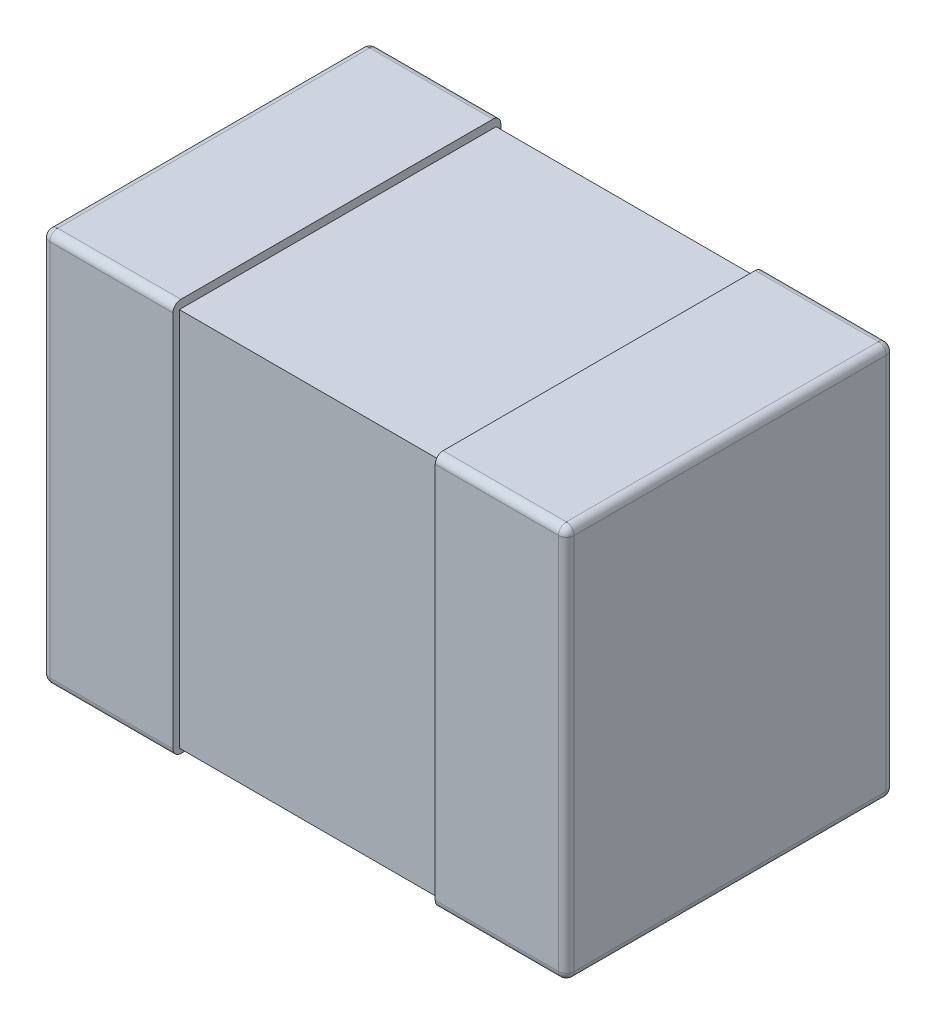
ISO-10303-21;
HEADER;
FILE_DESCRIPTION(('STEP AP214'),'2;1');
FILE_NAME('part.step','',(''),(''),'','','');
FILE_SCHEMA(('AUTOMOTIVE_DESIGN { 1 0 10303 214 1 1 1 1 }'));
ENDSEC;
DATA;
#1=APPLICATION_CONTEXT('core data for automotive mechanical design processes');
#2=APPLICATION_PROTOCOL_DEFINITION('international standard','automotive_design',2000,#1);
#3=PRODUCT_CONTEXT('',#1,'mechanical');
#4=PRODUCT('Part','Part','',(#3));
#5=PRODUCT_RELATED_PRODUCT_CATEGORY('part','',(#4));
#6=PRODUCT_DEFINITION_FORMATION('','',#4);
#7=PRODUCT_DEFINITION_CONTEXT('part definition',#1,'design');
#8=PRODUCT_DEFINITION('design','',#6,#7);
#9=PRODUCT_DEFINITION_SHAPE('','',#8);
#10=(LENGTH_UNIT() NAMED_UNIT(*) SI_UNIT(.MILLI.,.METRE.));
#11=(NAMED_UNIT(*) PLANE_ANGLE_UNIT() SI_UNIT($,.RADIAN.));
#12=(NAMED_UNIT(*) SI_UNIT($,.STERADIAN.) SOLID_ANGLE_UNIT());
#13=UNCERTAINTY_MEASURE_WITH_UNIT(LENGTH_MEASURE(1.E-05),#10,'distance_accuracy_value','');
#14=(GEOMETRIC_REPRESENTATION_CONTEXT(3) GLOBAL_UNCERTAINTY_ASSIGNED_CONTEXT((#13)) GLOBAL_UNIT_ASSIGNED_CONTEXT((#10,
#11,#12)) REPRESENTATION_CONTEXT('',''));
#15=CARTESIAN_POINT('',(0.,0.,0.));
#16=DIRECTION('',(0.,0.,1.));
#17=DIRECTION('',(1.,0.,0.));
#18=AXIS2_PLACEMENT_3D('',#15,#16,#17);
#19=CARTESIAN_POINT('',(0.5,1.5,0.));
#20=DIRECTION('',(1.,0.,0.));
#21=DIRECTION('',(0.,0.,-1.));
#22=AXIS2_PLACEMENT_3D('',#19,#20,#21);
#23=PLANE('',#22);
#24=DIRECTION('',(0.,1.,0.));
#25=VECTOR('',#24,1.);
#26=CARTESIAN_POINT('',(0.5,0.,0.));
#27=LINE('',#26,#25);
#28=CARTESIAN_POINT('',(0.5,0.03,0.));
#29=VERTEX_POINT('',#28);
#30=CARTESIAN_POINT('',(0.5,1.47,0.));
#31=VERTEX_POINT('',#30);
#32=EDGE_CURVE('E11',#29,#31,#27,.T.);
#33=ORIENTED_EDGE('',*,*,#32,.T.);
#34=CARTESIAN_POINT('',(0.5,1.47,0.03));
#35=DIRECTION('',(1.,0.,0.));
#36=DIRECTION('',(0.,0.,-1.));
#37=AXIS2_PLACEMENT_3D('',#34,#35,#36);
#38=CIRCLE('',#37,0.03);
#39=CARTESIAN_POINT('',(0.5,1.5,0.03));
#40=VERTEX_POINT('',#39);
#41=EDGE_CURVE('E24',#31,#40,#38,.T.);
#42=ORIENTED_EDGE('',*,*,#41,.T.);
#43=DIRECTION('',(0.,0.,1.));
#44=VECTOR('',#43,1.);
#45=CARTESIAN_POINT('',(0.5,1.5,0.));
#46=LINE('',#45,#44);
#47=CARTESIAN_POINT('',(0.5,1.5,1.22));
#48=VERTEX_POINT('',#47);
#49=EDGE_CURVE('E381',#40,#48,#46,.T.);
#50=ORIENTED_EDGE('',*,*,#49,.T.);
#51=CARTESIAN_POINT('',(0.5,1.47,1.22));
#52=DIRECTION('',(1.,0.,0.));
#53=DIRECTION('',(0.,0.,-1.));
#54=AXIS2_PLACEMENT_3D('',#51,#52,#53);
#55=CIRCLE('',#54,0.0300000000000001);
#56=CARTESIAN_POINT('',(0.5,1.47,1.25));
#57=VERTEX_POINT('',#56);
#58=EDGE_CURVE('E379',#48,#57,#55,.T.);
#59=ORIENTED_EDGE('',*,*,#58,.T.);
#60=DIRECTION('',(0.,-1.,0.));
#61=VECTOR('',#60,1.);
#62=CARTESIAN_POINT('',(0.5,0.,1.25));
#63=LINE('',#62,#61);
#64=CARTESIAN_POINT('',(0.5,0.0299999999999998,1.25));
#65=VERTEX_POINT('',#64);
#66=EDGE_CURVE('E377',#57,#65,#63,.T.);
#67=ORIENTED_EDGE('',*,*,#66,.T.);
#68=CARTESIAN_POINT('',(0.5,0.0299999999999998,1.22));
#69=DIRECTION('',(1.,0.,0.));
#70=DIRECTION('',(0.,0.,-1.));
#71=AXIS2_PLACEMENT_3D('',#68,#69,#70);
#72=CIRCLE('',#71,0.0300000000000001);
#73=CARTESIAN_POINT('',(0.5,0.,1.22));
#74=VERTEX_POINT('',#73);
#75=EDGE_CURVE('E375',#65,#74,#72,.T.);
#76=ORIENTED_EDGE('',*,*,#75,.T.);
#77=DIRECTION('',(0.,0.,-1.));
#78=VECTOR('',#77,1.);
#79=CARTESIAN_POINT('',(0.5,0.,0.));
#80=LINE('',#79,#78);
#81=CARTESIAN_POINT('',(0.5,0.,0.03));
#82=VERTEX_POINT('',#81);
#83=EDGE_CURVE('E373',#74,#82,#80,.T.);
#84=ORIENTED_EDGE('',*,*,#83,.T.);
#85=CARTESIAN_POINT('',(0.5,0.03,0.03));
#86=DIRECTION('',(1.,0.,0.));
#87=DIRECTION('',(0.,0.,-1.));
#88=AXIS2_PLACEMENT_3D('',#85,#86,#87);
#89=CIRCLE('',#88,0.03);
#90=EDGE_CURVE('E371',#82,#29,#89,.T.);
#91=ORIENTED_EDGE('',*,*,#90,.T.);
#92=EDGE_LOOP('',(#33,#42,#50,#59,#67,#76,#84,#91));
#93=FACE_BOUND('',#92,.T.);
#94=DIRECTION('',(0.,0.,-1.));
#95=VECTOR('',#94,1.);
#96=CARTESIAN_POINT('',(0.5,0.0205616848063398,1.22589832555352));
#97=LINE('',#96,#95);
#98=CARTESIAN_POINT('',(0.5,0.0205616848063398,1.22589832555352));
#99=VERTEX_POINT('',#98);
#100=CARTESIAN_POINT('',(0.5,0.0205616848063398,0.0178314310494022));
#101=VERTEX_POINT('',#100);
#102=EDGE_CURVE('E369',#99,#101,#97,.T.);
#103=ORIENTED_EDGE('',*,*,#102,.F.);
#104=DIRECTION('',(0.,-1.,0.));
#105=VECTOR('',#104,1.);
#106=CARTESIAN_POINT('',(0.5,1.46898790953186,1.22589832555352));
#107=LINE('',#106,#105);
#108=CARTESIAN_POINT('',(0.5,1.46898790953186,1.22589832555352));
#109=VERTEX_POINT('',#108);
#110=EDGE_CURVE('E366',#109,#99,#107,.T.);
#111=ORIENTED_EDGE('',*,*,#110,.F.);
#112=DIRECTION('',(0.,0.,1.));
#113=VECTOR('',#112,1.);
#114=CARTESIAN_POINT('',(0.5,1.46898790953186,1.22589832555352));
#115=LINE('',#114,#113);
#116=CARTESIAN_POINT('',(0.5,1.46898790953186,0.0178314310494022));
#117=VERTEX_POINT('',#116);
#118=EDGE_CURVE('E363',#117,#109,#115,.T.);
#119=ORIENTED_EDGE('',*,*,#118,.F.);
#120=DIRECTION('',(0.,1.,0.));
#121=VECTOR('',#120,1.);
#122=CARTESIAN_POINT('',(0.5,1.46898790953186,0.0178314310494022));
#123=LINE('',#122,#121);
#124=EDGE_CURVE('E360',#101,#117,#123,.T.);
#125=ORIENTED_EDGE('',*,*,#124,.F.);
#126=EDGE_LOOP('',(#103,#111,#119,#125));
#127=FACE_BOUND('',#126,.T.);
#128=ADVANCED_FACE('F17',(#93,#127),#23,.T.);
#129=CARTESIAN_POINT('',(0.5,0.,0.));
#130=DIRECTION('',(0.,0.,1.));
#131=DIRECTION('',(1.,0.,0.));
#132=AXIS2_PLACEMENT_3D('',#129,#130,#131);
#133=PLANE('',#132);
#134=DIRECTION('',(0.,1.,0.));
#135=VECTOR('',#134,1.);
#136=CARTESIAN_POINT('',(0.03,0.,0.));
#137=LINE('',#136,#135);
#138=CARTESIAN_POINT('',(0.03,0.03,0.));
#139=VERTEX_POINT('',#138);
#140=CARTESIAN_POINT('',(0.03,1.47,0.));
#141=VERTEX_POINT('',#140);
#142=EDGE_CURVE('E358',#139,#141,#137,.T.);
#143=ORIENTED_EDGE('',*,*,#142,.T.);
#144=DIRECTION('',(1.,0.,0.));
#145=VECTOR('',#144,1.);
#146=CARTESIAN_POINT('',(0.5,1.47,0.));
#147=LINE('',#146,#145);
#148=EDGE_CURVE('E356',#141,#31,#147,.T.);
#149=ORIENTED_EDGE('',*,*,#148,.T.);
#150=ORIENTED_EDGE('',*,*,#32,.F.);
#151=DIRECTION('',(-1.,0.,0.));
#152=VECTOR('',#151,1.);
#153=CARTESIAN_POINT('',(0.5,0.03,0.));
#154=LINE('',#153,#152);
#155=EDGE_CURVE('E354',#29,#139,#154,.T.);
#156=ORIENTED_EDGE('',*,*,#155,.T.);
#157=EDGE_LOOP('',(#143,#149,#150,#156));
#158=FACE_BOUND('',#157,.T.);
#159=ADVANCED_FACE('F487',(#158),#133,.F.);
#160=CARTESIAN_POINT('',(0.5,1.5,0.));
#161=DIRECTION('',(0.,-1.,0.));
#162=DIRECTION('',(0.,0.,-1.));
#163=AXIS2_PLACEMENT_3D('',#160,#161,#162);
#164=PLANE('',#163);
#165=ORIENTED_EDGE('',*,*,#49,.F.);
#166=DIRECTION('',(-1.,0.,0.));
#167=VECTOR('',#166,1.);
#168=CARTESIAN_POINT('',(0.5,1.5,0.03));
#169=LINE('',#168,#167);
#170=CARTESIAN_POINT('',(0.03,1.5,0.03));
#171=VERTEX_POINT('',#170);
#172=EDGE_CURVE('E352',#40,#171,#169,.T.);
#173=ORIENTED_EDGE('',*,*,#172,.T.);
#174=DIRECTION('',(0.,0.,1.));
#175=VECTOR('',#174,1.);
#176=CARTESIAN_POINT('',(0.03,1.5,0.));
#177=LINE('',#176,#175);
#178=CARTESIAN_POINT('',(0.03,1.5,1.22));
#179=VERTEX_POINT('',#178);
#180=EDGE_CURVE('E350',#171,#179,#177,.T.);
#181=ORIENTED_EDGE('',*,*,#180,.T.);
#182=DIRECTION('',(1.,0.,0.));
#183=VECTOR('',#182,1.);
#184=CARTESIAN_POINT('',(0.5,1.5,1.22));
#185=LINE('',#184,#183);
#186=EDGE_CURVE('E347',#179,#48,#185,.T.);
#187=ORIENTED_EDGE('',*,*,#186,.T.);
#188=EDGE_LOOP('',(#165,#173,#181,#187));
#189=FACE_BOUND('',#188,.T.);
#190=ADVANCED_FACE('F389',(#189),#164,.F.);
#191=CARTESIAN_POINT('',(0.5,0.,1.25));
#192=DIRECTION('',(0.,0.,-1.));
#193=DIRECTION('',(-1.,0.,0.));
#194=AXIS2_PLACEMENT_3D('',#191,#192,#193);
#195=PLANE('',#194);
#196=DIRECTION('',(0.,-1.,0.));
#197=VECTOR('',#196,1.);
#198=CARTESIAN_POINT('',(0.03,0.,1.25));
#199=LINE('',#198,#197);
#200=CARTESIAN_POINT('',(0.03,1.47,1.25));
#201=VERTEX_POINT('',#200);
#202=CARTESIAN_POINT('',(0.03,0.0299999999999998,1.25));
#203=VERTEX_POINT('',#202);
#204=EDGE_CURVE('E345',#201,#203,#199,.T.);
#205=ORIENTED_EDGE('',*,*,#204,.T.);
#206=DIRECTION('',(1.,0.,0.));
#207=VECTOR('',#206,1.);
#208=CARTESIAN_POINT('',(0.5,0.0299999999999998,1.25));
#209=LINE('',#208,#207);
#210=EDGE_CURVE('E342',#203,#65,#209,.T.);
#211=ORIENTED_EDGE('',*,*,#210,.T.);
#212=ORIENTED_EDGE('',*,*,#66,.F.);
#213=DIRECTION('',(-1.,0.,0.));
#214=VECTOR('',#213,1.);
#215=CARTESIAN_POINT('',(0.5,1.47,1.25));
#216=LINE('',#215,#214);
#217=EDGE_CURVE('E339',#57,#201,#216,.T.);
#218=ORIENTED_EDGE('',*,*,#217,.T.);
#219=EDGE_LOOP('',(#205,#211,#212,#218));
#220=FACE_BOUND('',#219,.T.);
#221=ADVANCED_FACE('F465',(#220),#195,.F.);
#222=CARTESIAN_POINT('',(0.5,0.,0.));
#223=DIRECTION('',(0.,1.,0.));
#224=DIRECTION('',(0.,0.,1.));
#225=AXIS2_PLACEMENT_3D('',#222,#223,#224);
#226=PLANE('',#225);
#227=DIRECTION('',(0.,0.,-1.));
#228=VECTOR('',#227,1.);
#229=CARTESIAN_POINT('',(0.03,0.,0.));
#230=LINE('',#229,#228);
#231=CARTESIAN_POINT('',(0.03,0.,1.22));
#232=VERTEX_POINT('',#231);
#233=CARTESIAN_POINT('',(0.03,0.,0.03));
#234=VERTEX_POINT('',#233);
#235=EDGE_CURVE('E337',#232,#234,#230,.T.);
#236=ORIENTED_EDGE('',*,*,#235,.T.);
#237=DIRECTION('',(1.,0.,0.));
#238=VECTOR('',#237,1.);
#239=CARTESIAN_POINT('',(0.5,0.,0.03));
#240=LINE('',#239,#238);
#241=EDGE_CURVE('E334',#234,#82,#240,.T.);
#242=ORIENTED_EDGE('',*,*,#241,.T.);
#243=ORIENTED_EDGE('',*,*,#83,.F.);
#244=DIRECTION('',(-1.,0.,0.));
#245=VECTOR('',#244,1.);
#246=CARTESIAN_POINT('',(0.5,0.,1.22));
#247=LINE('',#246,#245);
#248=EDGE_CURVE('E331',#74,#232,#247,.T.);
#249=ORIENTED_EDGE('',*,*,#248,.T.);
#250=EDGE_LOOP('',(#236,#242,#243,#249));
#251=FACE_BOUND('',#250,.T.);
#252=ADVANCED_FACE('F498',(#251),#226,.F.);
#253=CARTESIAN_POINT('',(0.,1.5,0.));
#254=DIRECTION('',(1.,0.,0.));
#255=DIRECTION('',(0.,0.,-1.));
#256=AXIS2_PLACEMENT_3D('',#253,#254,#255);
#257=PLANE('',#256);
#258=DIRECTION('',(0.,1.,0.));
#259=VECTOR('',#258,1.);
#260=CARTESIAN_POINT('',(0.,1.5,1.22));
#261=LINE('',#260,#259);
#262=CARTESIAN_POINT('',(0.,0.0299999999999998,1.22));
#263=VERTEX_POINT('',#262);
#264=CARTESIAN_POINT('',(0.,1.47,1.22));
#265=VERTEX_POINT('',#264);
#266=EDGE_CURVE('E329',#263,#265,#261,.T.);
#267=ORIENTED_EDGE('',*,*,#266,.T.);
#268=DIRECTION('',(0.,0.,-1.));
#269=VECTOR('',#268,1.);
#270=CARTESIAN_POINT('',(0.,1.47,0.));
#271=LINE('',#270,#269);
#272=CARTESIAN_POINT('',(0.,1.47,0.03));
#273=VERTEX_POINT('',#272);
#274=EDGE_CURVE('E327',#265,#273,#271,.T.);
#275=ORIENTED_EDGE('',*,*,#274,.T.);
#276=DIRECTION('',(0.,-1.,0.));
#277=VECTOR('',#276,1.);
#278=CARTESIAN_POINT('',(0.,1.5,0.03));
#279=LINE('',#278,#277);
#280=CARTESIAN_POINT('',(0.,0.03,0.03));
#281=VERTEX_POINT('',#280);
#282=EDGE_CURVE('E325',#273,#281,#279,.T.);
#283=ORIENTED_EDGE('',*,*,#282,.T.);
#284=DIRECTION('',(0.,0.,1.));
#285=VECTOR('',#284,1.);
#286=CARTESIAN_POINT('',(0.,0.0300000000000001,0.));
#287=LINE('',#286,#285);
#288=EDGE_CURVE('E322',#281,#263,#287,.T.);
#289=ORIENTED_EDGE('',*,*,#288,.T.);
#290=EDGE_LOOP('',(#267,#275,#283,#289));
#291=FACE_BOUND('',#290,.T.);
#292=ADVANCED_FACE('F449',(#291),#257,.F.);
#293=CARTESIAN_POINT('',(1.5,1.46898790953186,1.22589832555352));
#294=DIRECTION('',(0.,0.,-1.));
#295=DIRECTION('',(-1.,0.,0.));
#296=AXIS2_PLACEMENT_3D('',#293,#294,#295);
#297=PLANE('',#296);
#298=ORIENTED_EDGE('',*,*,#110,.T.);
#299=DIRECTION('',(-1.,0.,0.));
#300=VECTOR('',#299,1.);
#301=CARTESIAN_POINT('',(1.5,0.0205616848063398,1.22589832555352));
#302=LINE('',#301,#300);
#303=CARTESIAN_POINT('',(1.5,0.0205616848063398,1.22589832555352));
#304=VERTEX_POINT('',#303);
#305=EDGE_CURVE('E319',#304,#99,#302,.T.);
#306=ORIENTED_EDGE('',*,*,#305,.F.);
#307=DIRECTION('',(0.,-1.,0.));
#308=VECTOR('',#307,1.);
#309=CARTESIAN_POINT('',(1.5,1.46898790953186,1.22589832555352));
#310=LINE('',#309,#308);
#311=CARTESIAN_POINT('',(1.5,1.46898790953186,1.22589832555352));
#312=VERTEX_POINT('',#311);
#313=EDGE_CURVE('E316',#312,#304,#310,.T.);
#314=ORIENTED_EDGE('',*,*,#313,.F.);
#315=DIRECTION('',(-1.,0.,0.));
#316=VECTOR('',#315,1.);
#317=CARTESIAN_POINT('',(1.5,1.46898790953186,1.22589832555352));
#318=LINE('',#317,#316);
#319=EDGE_CURVE('E313',#312,#109,#318,.T.);
#320=ORIENTED_EDGE('',*,*,#319,.T.);
#321=EDGE_LOOP('',(#298,#306,#314,#320));
#322=FACE_BOUND('',#321,.T.);
#323=ADVANCED_FACE('F503',(#322),#297,.F.);
#324=CARTESIAN_POINT('',(1.5,0.0205616848063398,1.22589832555352));
#325=DIRECTION('',(0.,1.,0.));
#326=DIRECTION('',(0.,0.,1.));
#327=AXIS2_PLACEMENT_3D('',#324,#325,#326);
#328=PLANE('',#327);
#329=ORIENTED_EDGE('',*,*,#102,.T.);
#330=DIRECTION('',(-1.,0.,0.));
#331=VECTOR('',#330,1.);
#332=CARTESIAN_POINT('',(1.5,0.0205616848063398,0.0178314310494022));
#333=LINE('',#332,#331);
#334=CARTESIAN_POINT('',(1.5,0.0205616848063398,0.0178314310494022));
#335=VERTEX_POINT('',#334);
#336=EDGE_CURVE('E310',#335,#101,#333,.T.);
#337=ORIENTED_EDGE('',*,*,#336,.F.);
#338=DIRECTION('',(0.,0.,-1.));
#339=VECTOR('',#338,1.);
#340=CARTESIAN_POINT('',(1.5,0.0205616848063398,1.22589832555352));
#341=LINE('',#340,#339);
#342=EDGE_CURVE('E307',#304,#335,#341,.T.);
#343=ORIENTED_EDGE('',*,*,#342,.F.);
#344=ORIENTED_EDGE('',*,*,#305,.T.);
#345=EDGE_LOOP('',(#329,#337,#343,#344));
#346=FACE_BOUND('',#345,.T.);
#347=ADVANCED_FACE('F506',(#346),#328,.F.);
#348=CARTESIAN_POINT('',(1.5,1.46898790953186,0.0178314310494022));
#349=DIRECTION('',(0.,0.,1.));
#350=DIRECTION('',(1.,0.,0.));
#351=AXIS2_PLACEMENT_3D('',#348,#349,#350);
#352=PLANE('',#351);
#353=ORIENTED_EDGE('',*,*,#124,.T.);
#354=DIRECTION('',(-1.,0.,0.));
#355=VECTOR('',#354,1.);
#356=CARTESIAN_POINT('',(1.5,1.46898790953186,0.0178314310494022));
#357=LINE('',#356,#355);
#358=CARTESIAN_POINT('',(1.5,1.46898790953186,0.0178314310494022));
#359=VERTEX_POINT('',#358);
#360=EDGE_CURVE('E304',#359,#117,#357,.T.);
#361=ORIENTED_EDGE('',*,*,#360,.F.);
#362=DIRECTION('',(0.,1.,0.));
#363=VECTOR('',#362,1.);
#364=CARTESIAN_POINT('',(1.5,1.46898790953186,0.0178314310494022));
#365=LINE('',#364,#363);
#366=EDGE_CURVE('E301',#335,#359,#365,.T.);
#367=ORIENTED_EDGE('',*,*,#366,.F.);
#368=ORIENTED_EDGE('',*,*,#336,.T.);
#369=EDGE_LOOP('',(#353,#361,#367,#368));
#370=FACE_BOUND('',#369,.T.);
#371=ADVANCED_FACE('F510',(#370),#352,.F.);
#372=CARTESIAN_POINT('',(1.5,1.46898790953186,1.22589832555352));
#373=DIRECTION('',(0.,-1.,0.));
#374=DIRECTION('',(0.,0.,-1.));
#375=AXIS2_PLACEMENT_3D('',#372,#373,#374);
#376=PLANE('',#375);
#377=ORIENTED_EDGE('',*,*,#118,.T.);
#378=ORIENTED_EDGE('',*,*,#319,.F.);
#379=DIRECTION('',(0.,0.,1.));
#380=VECTOR('',#379,1.);
#381=CARTESIAN_POINT('',(1.5,1.46898790953186,1.22589832555352));
#382=LINE('',#381,#380);
#383=EDGE_CURVE('E298',#359,#312,#382,.T.);
#384=ORIENTED_EDGE('',*,*,#383,.F.);
#385=ORIENTED_EDGE('',*,*,#360,.T.);
#386=EDGE_LOOP('',(#377,#378,#384,#385));
#387=FACE_BOUND('',#386,.T.);
#388=ADVANCED_FACE('F514',(#387),#376,.F.);
#389=CARTESIAN_POINT('',(1.5,0.,1.25));
#390=DIRECTION('',(1.,0.,0.));
#391=DIRECTION('',(0.,0.,-1.));
#392=AXIS2_PLACEMENT_3D('',#389,#390,#391);
#393=PLANE('',#392);
#394=DIRECTION('',(0.,0.,1.));
#395=VECTOR('',#394,1.);
#396=CARTESIAN_POINT('',(1.5,1.5,1.25));
#397=LINE('',#396,#395);
#398=CARTESIAN_POINT('',(1.5,1.5,0.0300000000000001));
#399=VERTEX_POINT('',#398);
#400=CARTESIAN_POINT('',(1.5,1.5,1.22));
#401=VERTEX_POINT('',#400);
#402=EDGE_CURVE('E296',#399,#401,#397,.T.);
#403=ORIENTED_EDGE('',*,*,#402,.F.);
#404=CARTESIAN_POINT('',(1.5,1.47,0.0300000000000001));
#405=DIRECTION('',(-1.,0.,0.));
#406=DIRECTION('',(0.,0.,-1.));
#407=AXIS2_PLACEMENT_3D('',#404,#405,#406);
#408=CIRCLE('',#407,0.03);
#409=CARTESIAN_POINT('',(1.5,1.47,0.));
#410=VERTEX_POINT('',#409);
#411=EDGE_CURVE('E294',#399,#410,#408,.T.);
#412=ORIENTED_EDGE('',*,*,#411,.T.);
#413=DIRECTION('',(0.,1.,0.));
#414=VECTOR('',#413,1.);
#415=CARTESIAN_POINT('',(1.5,1.5,0.));
#416=LINE('',#415,#414);
#417=CARTESIAN_POINT('',(1.5,0.0300000000000001,0.));
#418=VERTEX_POINT('',#417);
#419=EDGE_CURVE('E291',#418,#410,#416,.T.);
#420=ORIENTED_EDGE('',*,*,#419,.F.);
#421=CARTESIAN_POINT('',(1.5,0.0300000000000001,0.03));
#422=DIRECTION('',(-1.,0.,0.));
#423=DIRECTION('',(0.,0.,-1.));
#424=AXIS2_PLACEMENT_3D('',#421,#422,#423);
#425=CIRCLE('',#424,0.03);
#426=CARTESIAN_POINT('',(1.5,0.,0.0300000000000001));
#427=VERTEX_POINT('',#426);
#428=EDGE_CURVE('E289',#418,#427,#425,.T.);
#429=ORIENTED_EDGE('',*,*,#428,.T.);
#430=DIRECTION('',(0.,0.,-1.));
#431=VECTOR('',#430,1.);
#432=CARTESIAN_POINT('',(1.5,0.,1.25));
#433=LINE('',#432,#431);
#434=CARTESIAN_POINT('',(1.5,0.,1.22));
#435=VERTEX_POINT('',#434);
#436=EDGE_CURVE('E286',#435,#427,#433,.T.);
#437=ORIENTED_EDGE('',*,*,#436,.F.);
#438=CARTESIAN_POINT('',(1.5,0.03,1.22));
#439=DIRECTION('',(-1.,0.,0.));
#440=DIRECTION('',(0.,0.,-1.));
#441=AXIS2_PLACEMENT_3D('',#438,#439,#440);
#442=CIRCLE('',#441,0.0300000000000001);
#443=CARTESIAN_POINT('',(1.5,0.0300000000000001,1.25));
#444=VERTEX_POINT('',#443);
#445=EDGE_CURVE('E284',#435,#444,#442,.T.);
#446=ORIENTED_EDGE('',*,*,#445,.T.);
#447=DIRECTION('',(0.,-1.,0.));
#448=VECTOR('',#447,1.);
#449=CARTESIAN_POINT('',(1.5,1.5,1.25));
#450=LINE('',#449,#448);
#451=CARTESIAN_POINT('',(1.5,1.47,1.25));
#452=VERTEX_POINT('',#451);
#453=EDGE_CURVE('E281',#452,#444,#450,.T.);
#454=ORIENTED_EDGE('',*,*,#453,.F.);
#455=CARTESIAN_POINT('',(1.5,1.47,1.22));
#456=DIRECTION('',(-1.,0.,0.));
#457=DIRECTION('',(0.,0.,-1.));
#458=AXIS2_PLACEMENT_3D('',#455,#456,#457);
#459=CIRCLE('',#458,0.0300000000000001);
#460=EDGE_CURVE('E278',#452,#401,#459,.T.);
#461=ORIENTED_EDGE('',*,*,#460,.T.);
#462=EDGE_LOOP('',(#403,#412,#420,#429,#437,#446,#454,#461));
#463=FACE_BOUND('',#462,.T.);
#464=ORIENTED_EDGE('',*,*,#383,.T.);
#465=ORIENTED_EDGE('',*,*,#313,.T.);
#466=ORIENTED_EDGE('',*,*,#342,.T.);
#467=ORIENTED_EDGE('',*,*,#366,.T.);
#468=EDGE_LOOP('',(#464,#465,#466,#467));
#469=FACE_BOUND('',#468,.T.);
#470=ADVANCED_FACE('F518',(#463,#469),#393,.F.);
#471=CARTESIAN_POINT('',(2.,1.5,1.25));
#472=DIRECTION('',(0.,0.,-1.));
#473=DIRECTION('',(-1.,0.,0.));
#474=AXIS2_PLACEMENT_3D('',#471,#472,#473);
#475=PLANE('',#474);
#476=DIRECTION('',(0.,1.,0.));
#477=VECTOR('',#476,1.);
#478=CARTESIAN_POINT('',(1.97,1.5,1.25));
#479=LINE('',#478,#477);
#480=CARTESIAN_POINT('',(1.97,0.0300000000000001,1.25));
#481=VERTEX_POINT('',#480);
#482=CARTESIAN_POINT('',(1.97,1.47,1.25));
#483=VERTEX_POINT('',#482);
#484=EDGE_CURVE('E207',#481,#483,#479,.T.);
#485=ORIENTED_EDGE('',*,*,#484,.T.);
#486=DIRECTION('',(-1.,0.,0.));
#487=VECTOR('',#486,1.);
#488=CARTESIAN_POINT('',(2.,1.47,1.25));
#489=LINE('',#488,#487);
#490=EDGE_CURVE('E274',#483,#452,#489,.T.);
#491=ORIENTED_EDGE('',*,*,#490,.T.);
#492=ORIENTED_EDGE('',*,*,#453,.T.);
#493=DIRECTION('',(1.,0.,0.));
#494=VECTOR('',#493,1.);
#495=CARTESIAN_POINT('',(2.,0.0300000000000001,1.25));
#496=LINE('',#495,#494);
#497=EDGE_CURVE('E272',#444,#481,#496,.T.);
#498=ORIENTED_EDGE('',*,*,#497,.T.);
#499=EDGE_LOOP('',(#485,#491,#492,#498));
#500=FACE_BOUND('',#499,.T.);
#501=ADVANCED_FACE('F522',(#500),#475,.F.);
#502=CARTESIAN_POINT('',(2.,0.,1.25));
#503=DIRECTION('',(0.,1.,0.));
#504=DIRECTION('',(0.,0.,1.));
#505=AXIS2_PLACEMENT_3D('',#502,#503,#504);
#506=PLANE('',#505);
#507=ORIENTED_EDGE('',*,*,#436,.T.);
#508=DIRECTION('',(1.,0.,0.));
#509=VECTOR('',#508,1.);
#510=CARTESIAN_POINT('',(2.,0.,0.0300000000000001));
#511=LINE('',#510,#509);
#512=CARTESIAN_POINT('',(1.97,0.,0.0300000000000001));
#513=VERTEX_POINT('',#512);
#514=EDGE_CURVE('E270',#427,#513,#511,.T.);
#515=ORIENTED_EDGE('',*,*,#514,.T.);
#516=DIRECTION('',(0.,0.,1.));
#517=VECTOR('',#516,1.);
#518=CARTESIAN_POINT('',(1.97,0.,1.25));
#519=LINE('',#518,#517);
#520=CARTESIAN_POINT('',(1.97,0.,1.22));
#521=VERTEX_POINT('',#520);
#522=EDGE_CURVE('E268',#513,#521,#519,.T.);
#523=ORIENTED_EDGE('',*,*,#522,.T.);
#524=DIRECTION('',(-1.,0.,0.));
#525=VECTOR('',#524,1.);
#526=CARTESIAN_POINT('',(2.,0.,1.22));
#527=LINE('',#526,#525);
#528=EDGE_CURVE('E265',#521,#435,#527,.T.);
#529=ORIENTED_EDGE('',*,*,#528,.T.);
#530=EDGE_LOOP('',(#507,#515,#523,#529));
#531=FACE_BOUND('',#530,.T.);
#532=ADVANCED_FACE('F526',(#531),#506,.F.);
#533=CARTESIAN_POINT('',(2.,1.5,0.));
#534=DIRECTION('',(0.,0.,1.));
#535=DIRECTION('',(1.,0.,0.));
#536=AXIS2_PLACEMENT_3D('',#533,#534,#535);
#537=PLANE('',#536);
#538=ORIENTED_EDGE('',*,*,#419,.T.);
#539=DIRECTION('',(1.,0.,0.));
#540=VECTOR('',#539,1.);
#541=CARTESIAN_POINT('',(2.,1.47,0.));
#542=LINE('',#541,#540);
#543=CARTESIAN_POINT('',(1.97,1.47,0.));
#544=VERTEX_POINT('',#543);
#545=EDGE_CURVE('E263',#410,#544,#542,.T.);
#546=ORIENTED_EDGE('',*,*,#545,.T.);
#547=DIRECTION('',(0.,-1.,0.));
#548=VECTOR('',#547,1.);
#549=CARTESIAN_POINT('',(1.97,0.,0.));
#550=LINE('',#549,#548);
#551=CARTESIAN_POINT('',(1.97,0.0300000000000001,0.));
#552=VERTEX_POINT('',#551);
#553=EDGE_CURVE('E261',#544,#552,#550,.T.);
#554=ORIENTED_EDGE('',*,*,#553,.T.);
#555=DIRECTION('',(-1.,0.,0.));
#556=VECTOR('',#555,1.);
#557=CARTESIAN_POINT('',(2.,0.0300000000000001,0.));
#558=LINE('',#557,#556);
#559=EDGE_CURVE('E258',#552,#418,#558,.T.);
#560=ORIENTED_EDGE('',*,*,#559,.T.);
#561=EDGE_LOOP('',(#538,#546,#554,#560));
#562=FACE_BOUND('',#561,.T.);
#563=ADVANCED_FACE('F530',(#562),#537,.F.);
#564=CARTESIAN_POINT('',(2.,1.5,1.25));
#565=DIRECTION('',(0.,-1.,0.));
#566=DIRECTION('',(0.,0.,-1.));
#567=AXIS2_PLACEMENT_3D('',#564,#565,#566);
#568=PLANE('',#567);
#569=DIRECTION('',(0.,0.,-1.));
#570=VECTOR('',#569,1.);
#571=CARTESIAN_POINT('',(1.97,1.5,0.));
#572=LINE('',#571,#570);
#573=CARTESIAN_POINT('',(1.97,1.5,1.22));
#574=VERTEX_POINT('',#573);
#575=CARTESIAN_POINT('',(1.97,1.5,0.0300000000000001));
#576=VERTEX_POINT('',#575);
#577=EDGE_CURVE('E256',#574,#576,#572,.T.);
#578=ORIENTED_EDGE('',*,*,#577,.T.);
#579=DIRECTION('',(-1.,0.,0.));
#580=VECTOR('',#579,1.);
#581=CARTESIAN_POINT('',(2.,1.5,0.0300000000000001));
#582=LINE('',#581,#580);
#583=EDGE_CURVE('E253',#576,#399,#582,.T.);
#584=ORIENTED_EDGE('',*,*,#583,.T.);
#585=ORIENTED_EDGE('',*,*,#402,.T.);
#586=DIRECTION('',(1.,0.,0.));
#587=VECTOR('',#586,1.);
#588=CARTESIAN_POINT('',(2.,1.5,1.22));
#589=LINE('',#588,#587);
#590=EDGE_CURVE('E250',#401,#574,#589,.T.);
#591=ORIENTED_EDGE('',*,*,#590,.T.);
#592=EDGE_LOOP('',(#578,#584,#585,#591));
#593=FACE_BOUND('',#592,.T.);
#594=ADVANCED_FACE('F534',(#593),#568,.F.);
#595=CARTESIAN_POINT('',(2.,0.,1.25));
#596=DIRECTION('',(1.,0.,0.));
#597=DIRECTION('',(0.,0.,-1.));
#598=AXIS2_PLACEMENT_3D('',#595,#596,#597);
#599=PLANE('',#598);
#600=DIRECTION('',(0.,1.,0.));
#601=VECTOR('',#600,1.);
#602=CARTESIAN_POINT('',(2.,1.5,0.0300000000000001));
#603=LINE('',#602,#601);
#604=CARTESIAN_POINT('',(2.,0.03,0.0300000000000001));
#605=VERTEX_POINT('',#604);
#606=CARTESIAN_POINT('',(2.,1.47,0.0300000000000001));
#607=VERTEX_POINT('',#606);
#608=EDGE_CURVE('E248',#605,#607,#603,.T.);
#609=ORIENTED_EDGE('',*,*,#608,.T.);
#610=DIRECTION('',(0.,0.,1.));
#611=VECTOR('',#610,1.);
#612=CARTESIAN_POINT('',(2.,1.47,1.25));
#613=LINE('',#612,#611);
#614=CARTESIAN_POINT('',(2.,1.47,1.22));
#615=VERTEX_POINT('',#614);
#616=EDGE_CURVE('E180',#607,#615,#613,.T.);
#617=ORIENTED_EDGE('',*,*,#616,.T.);
#618=DIRECTION('',(0.,-1.,0.));
#619=VECTOR('',#618,1.);
#620=CARTESIAN_POINT('',(2.,0.,1.22));
#621=LINE('',#620,#619);
#622=CARTESIAN_POINT('',(2.,0.03,1.22));
#623=VERTEX_POINT('',#622);
#624=EDGE_CURVE('E174',#615,#623,#621,.T.);
#625=ORIENTED_EDGE('',*,*,#624,.T.);
#626=DIRECTION('',(0.,0.,-1.));
#627=VECTOR('',#626,1.);
#628=CARTESIAN_POINT('',(2.,0.03,0.));
#629=LINE('',#628,#627);
#630=EDGE_CURVE('E177',#623,#605,#629,.T.);
#631=ORIENTED_EDGE('',*,*,#630,.T.);
#632=EDGE_LOOP('',(#609,#617,#625,#631));
#633=FACE_BOUND('',#632,.T.);
#634=ADVANCED_FACE('F176',(#633),#599,.T.);
#635=CARTESIAN_POINT('',(0.03,0.03,0.));
#636=DIRECTION('',(0.,0.,-1.));
#637=DIRECTION('',(0.,1.,0.));
#638=AXIS2_PLACEMENT_3D('',#635,#636,#637);
#639=CYLINDRICAL_SURFACE('',#638,0.03);
#640=ORIENTED_EDGE('',*,*,#288,.F.);
#641=CARTESIAN_POINT('',(0.03,0.03,0.03));
#642=DIRECTION('',(0.,0.,1.));
#643=DIRECTION('',(0.,1.,0.));
#644=AXIS2_PLACEMENT_3D('',#641,#642,#643);
#645=CIRCLE('',#644,0.03);
#646=EDGE_CURVE('E196',#281,#234,#645,.T.);
#647=ORIENTED_EDGE('',*,*,#646,.T.);
#648=ORIENTED_EDGE('',*,*,#235,.F.);
#649=CARTESIAN_POINT('',(0.03,0.0299999999999998,1.22));
#650=DIRECTION('',(0.,0.,-1.));
#651=DIRECTION('',(0.,1.,0.));
#652=AXIS2_PLACEMENT_3D('',#649,#650,#651);
#653=CIRCLE('',#652,0.03);
#654=EDGE_CURVE('E242',#232,#263,#653,.T.);
#655=ORIENTED_EDGE('',*,*,#654,.T.);
#656=EDGE_LOOP('',(#640,#647,#648,#655));
#657=FACE_BOUND('',#656,.T.);
#658=ADVANCED_FACE('F445',(#657),#639,.T.);
#659=CARTESIAN_POINT('',(0.03,0.,0.03));
#660=DIRECTION('',(0.,1.,0.));
#661=DIRECTION('',(0.,0.,1.));
#662=AXIS2_PLACEMENT_3D('',#659,#660,#661);
#663=CYLINDRICAL_SURFACE('',#662,0.03);
#664=ORIENTED_EDGE('',*,*,#282,.F.);
#665=CARTESIAN_POINT('',(0.03,1.47,0.03));
#666=DIRECTION('',(0.,-1.,0.));
#667=DIRECTION('',(0.,0.,1.));
#668=AXIS2_PLACEMENT_3D('',#665,#666,#667);
#669=CIRCLE('',#668,0.03);
#670=EDGE_CURVE('E239',#273,#141,#669,.T.);
#671=ORIENTED_EDGE('',*,*,#670,.T.);
#672=ORIENTED_EDGE('',*,*,#142,.F.);
#673=CARTESIAN_POINT('',(0.03,0.03,0.03));
#674=DIRECTION('',(0.,1.,0.));
#675=DIRECTION('',(0.,0.,1.));
#676=AXIS2_PLACEMENT_3D('',#673,#674,#675);
#677=CIRCLE('',#676,0.03);
#678=EDGE_CURVE('E236',#139,#281,#677,.T.);
#679=ORIENTED_EDGE('',*,*,#678,.T.);
#680=EDGE_LOOP('',(#664,#671,#672,#679));
#681=FACE_BOUND('',#680,.T.);
#682=ADVANCED_FACE('F453',(#681),#663,.T.);
#683=CARTESIAN_POINT('',(0.03,0.,1.22));
#684=DIRECTION('',(0.,-1.,0.));
#685=DIRECTION('',(0.,0.,-1.));
#686=AXIS2_PLACEMENT_3D('',#683,#684,#685);
#687=CYLINDRICAL_SURFACE('',#686,0.0300000000000001);
#688=ORIENTED_EDGE('',*,*,#266,.F.);
#689=CARTESIAN_POINT('',(0.03,0.0299999999999998,1.22));
#690=DIRECTION('',(0.,1.,0.));
#691=DIRECTION('',(0.,0.,-1.));
#692=AXIS2_PLACEMENT_3D('',#689,#690,#691);
#693=CIRCLE('',#692,0.0300000000000001);
#694=EDGE_CURVE('E233',#263,#203,#693,.T.);
#695=ORIENTED_EDGE('',*,*,#694,.T.);
#696=ORIENTED_EDGE('',*,*,#204,.F.);
#697=CARTESIAN_POINT('',(0.03,1.47,1.22));
#698=DIRECTION('',(0.,-1.,0.));
#699=DIRECTION('',(0.,0.,-1.));
#700=AXIS2_PLACEMENT_3D('',#697,#698,#699);
#701=CIRCLE('',#700,0.0300000000000001);
#702=EDGE_CURVE('E230',#201,#265,#701,.T.);
#703=ORIENTED_EDGE('',*,*,#702,.T.);
#704=EDGE_LOOP('',(#688,#695,#696,#703));
#705=FACE_BOUND('',#704,.T.);
#706=ADVANCED_FACE('F473',(#705),#687,.T.);
#707=CARTESIAN_POINT('',(0.03,1.47,0.));
#708=DIRECTION('',(0.,0.,1.));
#709=DIRECTION('',(1.,0.,0.));
#710=AXIS2_PLACEMENT_3D('',#707,#708,#709);
#711=CYLINDRICAL_SURFACE('',#710,0.03);
#712=ORIENTED_EDGE('',*,*,#180,.F.);
#713=CARTESIAN_POINT('',(0.03,1.47,0.03));
#714=DIRECTION('',(0.,0.,1.));
#715=DIRECTION('',(1.,0.,0.));
#716=AXIS2_PLACEMENT_3D('',#713,#714,#715);
#717=CIRCLE('',#716,0.03);
#718=EDGE_CURVE('E227',#171,#273,#717,.T.);
#719=ORIENTED_EDGE('',*,*,#718,.T.);
#720=ORIENTED_EDGE('',*,*,#274,.F.);
#721=CARTESIAN_POINT('',(0.03,1.47,1.22));
#722=DIRECTION('',(0.,0.,-1.));
#723=DIRECTION('',(1.,0.,0.));
#724=AXIS2_PLACEMENT_3D('',#721,#722,#723);
#725=CIRCLE('',#724,0.03);
#726=EDGE_CURVE('E224',#265,#179,#725,.T.);
#727=ORIENTED_EDGE('',*,*,#726,.T.);
#728=EDGE_LOOP('',(#712,#719,#720,#727));
#729=FACE_BOUND('',#728,.T.);
#730=ADVANCED_FACE('F456',(#729),#711,.T.);
#731=CARTESIAN_POINT('',(1.97,0.03,1.25));
#732=DIRECTION('',(0.,0.,1.));
#733=DIRECTION('',(1.,0.,0.));
#734=AXIS2_PLACEMENT_3D('',#731,#732,#733);
#735=CYLINDRICAL_SURFACE('',#734,0.0300000000000001);
#736=ORIENTED_EDGE('',*,*,#522,.F.);
#737=CARTESIAN_POINT('',(1.97,0.03,0.0300000000000001));
#738=DIRECTION('',(0.,0.,1.));
#739=DIRECTION('',(1.,0.,0.));
#740=AXIS2_PLACEMENT_3D('',#737,#738,#739);
#741=CIRCLE('',#740,0.0300000000000001);
#742=EDGE_CURVE('E194',#513,#605,#741,.T.);
#743=ORIENTED_EDGE('',*,*,#742,.T.);
#744=ORIENTED_EDGE('',*,*,#630,.F.);
#745=CARTESIAN_POINT('',(1.97,0.03,1.22));
#746=DIRECTION('',(0.,0.,-1.));
#747=DIRECTION('',(1.,0.,0.));
#748=AXIS2_PLACEMENT_3D('',#745,#746,#747);
#749=CIRCLE('',#748,0.0300000000000001);
#750=EDGE_CURVE('E191',#623,#521,#749,.T.);
#751=ORIENTED_EDGE('',*,*,#750,.T.);
#752=EDGE_LOOP('',(#736,#743,#744,#751));
#753=FACE_BOUND('',#752,.T.);
#754=ADVANCED_FACE('F190',(#753),#735,.T.);
#755=CARTESIAN_POINT('',(1.97,0.,0.0300000000000001));
#756=DIRECTION('',(0.,-1.,0.));
#757=DIRECTION('',(0.,0.,-1.));
#758=AXIS2_PLACEMENT_3D('',#755,#756,#757);
#759=CYLINDRICAL_SURFACE('',#758,0.03);
#760=ORIENTED_EDGE('',*,*,#553,.F.);
#761=CARTESIAN_POINT('',(1.97,1.47,0.0300000000000001));
#762=DIRECTION('',(0.,-1.,0.));
#763=DIRECTION('',(0.,0.,-1.));
#764=AXIS2_PLACEMENT_3D('',#761,#762,#763);
#765=CIRCLE('',#764,0.03);
#766=EDGE_CURVE('E204',#544,#607,#765,.T.);
#767=ORIENTED_EDGE('',*,*,#766,.T.);
#768=ORIENTED_EDGE('',*,*,#608,.F.);
#769=CARTESIAN_POINT('',(1.97,0.03,0.0300000000000001));
#770=DIRECTION('',(0.,1.,0.));
#771=DIRECTION('',(0.,0.,-1.));
#772=AXIS2_PLACEMENT_3D('',#769,#770,#771);
#773=CIRCLE('',#772,0.03);
#774=EDGE_CURVE('E212',#605,#552,#773,.T.);
#775=ORIENTED_EDGE('',*,*,#774,.T.);
#776=EDGE_LOOP('',(#760,#767,#768,#775));
#777=FACE_BOUND('',#776,.T.);
#778=ADVANCED_FACE('F551',(#777),#759,.T.);
#779=CARTESIAN_POINT('',(1.97,0.,1.22));
#780=DIRECTION('',(0.,1.,0.));
#781=DIRECTION('',(0.,0.,1.));
#782=AXIS2_PLACEMENT_3D('',#779,#780,#781);
#783=CYLINDRICAL_SURFACE('',#782,0.0300000000000001);
#784=ORIENTED_EDGE('',*,*,#624,.F.);
#785=CARTESIAN_POINT('',(1.97,1.47,1.22));
#786=DIRECTION('',(0.,-1.,0.));
#787=DIRECTION('',(0.,0.,1.));
#788=AXIS2_PLACEMENT_3D('',#785,#786,#787);
#789=CIRCLE('',#788,0.0300000000000001);
#790=EDGE_CURVE('E209',#615,#483,#789,.T.);
#791=ORIENTED_EDGE('',*,*,#790,.T.);
#792=ORIENTED_EDGE('',*,*,#484,.F.);
#793=CARTESIAN_POINT('',(1.97,0.03,1.22));
#794=DIRECTION('',(0.,1.,0.));
#795=DIRECTION('',(0.,0.,1.));
#796=AXIS2_PLACEMENT_3D('',#793,#794,#795);
#797=CIRCLE('',#796,0.0300000000000001);
#798=EDGE_CURVE('E201',#481,#623,#797,.T.);
#799=ORIENTED_EDGE('',*,*,#798,.T.);
#800=EDGE_LOOP('',(#784,#791,#792,#799));
#801=FACE_BOUND('',#800,.T.);
#802=ADVANCED_FACE('F206',(#801),#783,.T.);
#803=CARTESIAN_POINT('',(1.97,1.47,1.25));
#804=DIRECTION('',(0.,0.,-1.));
#805=DIRECTION('',(-1.,0.,0.));
#806=AXIS2_PLACEMENT_3D('',#803,#804,#805);
#807=CYLINDRICAL_SURFACE('',#806,0.0300000000000001);
#808=ORIENTED_EDGE('',*,*,#616,.F.);
#809=CARTESIAN_POINT('',(1.97,1.47,0.0300000000000001));
#810=DIRECTION('',(0.,0.,1.));
#811=DIRECTION('',(-1.,0.,0.));
#812=AXIS2_PLACEMENT_3D('',#809,#810,#811);
#813=CIRCLE('',#812,0.0300000000000001);
#814=EDGE_CURVE('E210',#607,#576,#813,.T.);
#815=ORIENTED_EDGE('',*,*,#814,.T.);
#816=ORIENTED_EDGE('',*,*,#577,.F.);
#817=CARTESIAN_POINT('',(1.97,1.47,1.22));
#818=DIRECTION('',(0.,0.,-1.));
#819=DIRECTION('',(-1.,0.,0.));
#820=AXIS2_PLACEMENT_3D('',#817,#818,#819);
#821=CIRCLE('',#820,0.0300000000000001);
#822=EDGE_CURVE('E215',#574,#615,#821,.T.);
#823=ORIENTED_EDGE('',*,*,#822,.T.);
#824=EDGE_LOOP('',(#808,#815,#816,#823));
#825=FACE_BOUND('',#824,.T.);
#826=ADVANCED_FACE('F411',(#825),#807,.T.);
#827=CARTESIAN_POINT('',(2.,1.47,0.0300000000000001));
#828=DIRECTION('',(-1.,0.,0.));
#829=DIRECTION('',(0.,0.,1.));
#830=AXIS2_PLACEMENT_3D('',#827,#828,#829);
#831=CYLINDRICAL_SURFACE('',#830,0.03);
#832=ORIENTED_EDGE('',*,*,#411,.F.);
#833=ORIENTED_EDGE('',*,*,#583,.F.);
#834=CARTESIAN_POINT('',(1.97,1.47,0.03));
#835=DIRECTION('',(1.,0.,0.));
#836=DIRECTION('',(0.,0.,-1.));
#837=AXIS2_PLACEMENT_3D('',#834,#835,#836);
#838=CIRCLE('',#837,0.03);
#839=EDGE_CURVE('E399',#544,#576,#838,.T.);
#840=ORIENTED_EDGE('',*,*,#839,.F.);
#841=ORIENTED_EDGE('',*,*,#545,.F.);
#842=EDGE_LOOP('',(#832,#833,#840,#841));
#843=FACE_BOUND('',#842,.T.);
#844=ADVANCED_FACE('F559',(#843),#831,.T.);
#845=CARTESIAN_POINT('',(1.97,1.47,0.0300000000000001));
#846=DIRECTION('',(0.,1.,0.));
#847=DIRECTION('',(1.,0.,0.));
#848=AXIS2_PLACEMENT_3D('',#845,#846,#847);
#849=SPHERICAL_SURFACE('',#848,0.03);
#850=ORIENTED_EDGE('',*,*,#814,.F.);
#851=ORIENTED_EDGE('',*,*,#766,.F.);
#852=ORIENTED_EDGE('',*,*,#839,.T.);
#853=EDGE_LOOP('',(#850,#851,#852));
#854=FACE_BOUND('',#853,.T.);
#855=ADVANCED_FACE('F562',(#854),#849,.T.);
#856=CARTESIAN_POINT('',(0.5,1.47,0.03));
#857=DIRECTION('',(-1.,0.,0.));
#858=DIRECTION('',(0.,0.,1.));
#859=AXIS2_PLACEMENT_3D('',#856,#857,#858);
#860=CYLINDRICAL_SURFACE('',#859,0.03);
#861=ORIENTED_EDGE('',*,*,#41,.F.);
#862=ORIENTED_EDGE('',*,*,#148,.F.);
#863=CARTESIAN_POINT('',(0.03,1.47,0.03));
#864=DIRECTION('',(-1.,0.,0.));
#865=DIRECTION('',(0.,0.,1.));
#866=AXIS2_PLACEMENT_3D('',#863,#864,#865);
#867=CIRCLE('',#866,0.03);
#868=EDGE_CURVE('E395',#171,#141,#867,.T.);
#869=ORIENTED_EDGE('',*,*,#868,.F.);
#870=ORIENTED_EDGE('',*,*,#172,.F.);
#871=EDGE_LOOP('',(#861,#862,#869,#870));
#872=FACE_BOUND('',#871,.T.);
#873=ADVANCED_FACE('F393',(#872),#860,.T.);
#874=CARTESIAN_POINT('',(0.03,1.47,0.03));
#875=DIRECTION('',(0.,1.,0.));
#876=DIRECTION('',(1.,0.,0.));
#877=AXIS2_PLACEMENT_3D('',#874,#875,#876);
#878=SPHERICAL_SURFACE('',#877,0.03);
#879=ORIENTED_EDGE('',*,*,#868,.T.);
#880=ORIENTED_EDGE('',*,*,#670,.F.);
#881=ORIENTED_EDGE('',*,*,#718,.F.);
#882=EDGE_LOOP('',(#879,#880,#881));
#883=FACE_BOUND('',#882,.T.);
#884=ADVANCED_FACE('F454',(#883),#878,.T.);
#885=CARTESIAN_POINT('',(2.,0.0300000000000001,0.03));
#886=DIRECTION('',(-1.,0.,0.));
#887=DIRECTION('',(0.,0.,1.));
#888=AXIS2_PLACEMENT_3D('',#885,#886,#887);
#889=CYLINDRICAL_SURFACE('',#888,0.03);
#890=ORIENTED_EDGE('',*,*,#428,.F.);
#891=ORIENTED_EDGE('',*,*,#559,.F.);
#892=CARTESIAN_POINT('',(1.97,0.03,0.03));
#893=DIRECTION('',(1.,0.,0.));
#894=DIRECTION('',(0.,0.,-1.));
#895=AXIS2_PLACEMENT_3D('',#892,#893,#894);
#896=CIRCLE('',#895,0.03);
#897=EDGE_CURVE('E400',#513,#552,#896,.T.);
#898=ORIENTED_EDGE('',*,*,#897,.F.);
#899=ORIENTED_EDGE('',*,*,#514,.F.);
#900=EDGE_LOOP('',(#890,#891,#898,#899));
#901=FACE_BOUND('',#900,.T.);
#902=ADVANCED_FACE('F571',(#901),#889,.T.);
#903=CARTESIAN_POINT('',(1.97,0.03,0.0300000000000001));
#904=DIRECTION('',(0.,1.,0.));
#905=DIRECTION('',(1.,0.,0.));
#906=AXIS2_PLACEMENT_3D('',#903,#904,#905);
#907=SPHERICAL_SURFACE('',#906,0.03);
#908=ORIENTED_EDGE('',*,*,#774,.F.);
#909=ORIENTED_EDGE('',*,*,#742,.F.);
#910=ORIENTED_EDGE('',*,*,#897,.T.);
#911=EDGE_LOOP('',(#908,#909,#910));
#912=FACE_BOUND('',#911,.T.);
#913=ADVANCED_FACE('F574',(#912),#907,.T.);
#914=CARTESIAN_POINT('',(0.5,0.03,0.03));
#915=DIRECTION('',(-1.,0.,0.));
#916=DIRECTION('',(0.,0.,1.));
#917=AXIS2_PLACEMENT_3D('',#914,#915,#916);
#918=CYLINDRICAL_SURFACE('',#917,0.03);
#919=ORIENTED_EDGE('',*,*,#90,.F.);
#920=ORIENTED_EDGE('',*,*,#241,.F.);
#921=CARTESIAN_POINT('',(0.03,0.03,0.03));
#922=DIRECTION('',(-1.,0.,0.));
#923=DIRECTION('',(0.,0.,1.));
#924=AXIS2_PLACEMENT_3D('',#921,#922,#923);
#925=CIRCLE('',#924,0.03);
#926=EDGE_CURVE('E405',#139,#234,#925,.T.);
#927=ORIENTED_EDGE('',*,*,#926,.F.);
#928=ORIENTED_EDGE('',*,*,#155,.F.);
#929=EDGE_LOOP('',(#919,#920,#927,#928));
#930=FACE_BOUND('',#929,.T.);
#931=ADVANCED_FACE('F440',(#930),#918,.T.);
#932=CARTESIAN_POINT('',(0.03,0.03,0.03));
#933=DIRECTION('',(0.,1.,0.));
#934=DIRECTION('',(1.,0.,0.));
#935=AXIS2_PLACEMENT_3D('',#932,#933,#934);
#936=SPHERICAL_SURFACE('',#935,0.03);
#937=ORIENTED_EDGE('',*,*,#926,.T.);
#938=ORIENTED_EDGE('',*,*,#646,.F.);
#939=ORIENTED_EDGE('',*,*,#678,.F.);
#940=EDGE_LOOP('',(#937,#938,#939));
#941=FACE_BOUND('',#940,.T.);
#942=ADVANCED_FACE('F435',(#941),#936,.T.);
#943=CARTESIAN_POINT('',(0.5,0.0299999999999998,1.22));
#944=DIRECTION('',(-1.,0.,0.));
#945=DIRECTION('',(0.,0.,1.));
#946=AXIS2_PLACEMENT_3D('',#943,#944,#945);
#947=CYLINDRICAL_SURFACE('',#946,0.0300000000000001);
#948=ORIENTED_EDGE('',*,*,#75,.F.);
#949=ORIENTED_EDGE('',*,*,#210,.F.);
#950=CARTESIAN_POINT('',(0.03,0.0299999999999998,1.22));
#951=DIRECTION('',(-1.,0.,0.));
#952=DIRECTION('',(0.,0.,1.));
#953=AXIS2_PLACEMENT_3D('',#950,#951,#952);
#954=CIRCLE('',#953,0.0300000000000001);
#955=EDGE_CURVE('E425',#232,#203,#954,.T.);
#956=ORIENTED_EDGE('',*,*,#955,.F.);
#957=ORIENTED_EDGE('',*,*,#248,.F.);
#958=EDGE_LOOP('',(#948,#949,#956,#957));
#959=FACE_BOUND('',#958,.T.);
#960=ADVANCED_FACE('F470',(#959),#947,.T.);
#961=CARTESIAN_POINT('',(0.03,0.0299999999999998,1.22));
#962=DIRECTION('',(0.,1.,0.));
#963=DIRECTION('',(1.,0.,0.));
#964=AXIS2_PLACEMENT_3D('',#961,#962,#963);
#965=SPHERICAL_SURFACE('',#964,0.03);
#966=ORIENTED_EDGE('',*,*,#694,.F.);
#967=ORIENTED_EDGE('',*,*,#654,.F.);
#968=ORIENTED_EDGE('',*,*,#955,.T.);
#969=EDGE_LOOP('',(#966,#967,#968));
#970=FACE_BOUND('',#969,.T.);
#971=ADVANCED_FACE('F475',(#970),#965,.T.);
#972=CARTESIAN_POINT('',(0.5,1.47,1.22));
#973=DIRECTION('',(-1.,0.,0.));
#974=DIRECTION('',(0.,0.,1.));
#975=AXIS2_PLACEMENT_3D('',#972,#973,#974);
#976=CYLINDRICAL_SURFACE('',#975,0.0300000000000001);
#977=ORIENTED_EDGE('',*,*,#58,.F.);
#978=ORIENTED_EDGE('',*,*,#186,.F.);
#979=CARTESIAN_POINT('',(0.03,1.47,1.22));
#980=DIRECTION('',(-1.,0.,0.));
#981=DIRECTION('',(0.,0.,1.));
#982=AXIS2_PLACEMENT_3D('',#979,#980,#981);
#983=CIRCLE('',#982,0.0300000000000001);
#984=EDGE_CURVE('E422',#201,#179,#983,.T.);
#985=ORIENTED_EDGE('',*,*,#984,.F.);
#986=ORIENTED_EDGE('',*,*,#217,.F.);
#987=EDGE_LOOP('',(#977,#978,#985,#986));
#988=FACE_BOUND('',#987,.T.);
#989=ADVANCED_FACE('F460',(#988),#976,.T.);
#990=CARTESIAN_POINT('',(0.03,1.47,1.22));
#991=DIRECTION('',(0.,1.,0.));
#992=DIRECTION('',(1.,0.,0.));
#993=AXIS2_PLACEMENT_3D('',#990,#991,#992);
#994=SPHERICAL_SURFACE('',#993,0.03);
#995=ORIENTED_EDGE('',*,*,#726,.F.);
#996=ORIENTED_EDGE('',*,*,#702,.F.);
#997=ORIENTED_EDGE('',*,*,#984,.T.);
#998=EDGE_LOOP('',(#995,#996,#997));
#999=FACE_BOUND('',#998,.T.);
#1000=ADVANCED_FACE('F483',(#999),#994,.T.);
#1001=CARTESIAN_POINT('',(2.,1.47,1.22));
#1002=DIRECTION('',(-1.,0.,0.));
#1003=DIRECTION('',(0.,0.,1.));
#1004=AXIS2_PLACEMENT_3D('',#1001,#1002,#1003);
#1005=CYLINDRICAL_SURFACE('',#1004,0.0300000000000001);
#1006=ORIENTED_EDGE('',*,*,#460,.F.);
#1007=ORIENTED_EDGE('',*,*,#490,.F.);
#1008=CARTESIAN_POINT('',(1.97,1.47,1.22));
#1009=DIRECTION('',(1.,0.,0.));
#1010=DIRECTION('',(0.,0.,-1.));
#1011=AXIS2_PLACEMENT_3D('',#1008,#1009,#1010);
#1012=CIRCLE('',#1011,0.0300000000000001);
#1013=EDGE_CURVE('E416',#574,#483,#1012,.T.);
#1014=ORIENTED_EDGE('',*,*,#1013,.F.);
#1015=ORIENTED_EDGE('',*,*,#590,.F.);
#1016=EDGE_LOOP('',(#1006,#1007,#1014,#1015));
#1017=FACE_BOUND('',#1016,.T.);
#1018=ADVANCED_FACE('F421',(#1017),#1005,.T.);
#1019=CARTESIAN_POINT('',(1.97,1.47,1.22));
#1020=DIRECTION('',(0.,1.,0.));
#1021=DIRECTION('',(1.,0.,0.));
#1022=AXIS2_PLACEMENT_3D('',#1019,#1020,#1021);
#1023=SPHERICAL_SURFACE('',#1022,0.03);
#1024=ORIENTED_EDGE('',*,*,#1013,.T.);
#1025=ORIENTED_EDGE('',*,*,#790,.F.);
#1026=ORIENTED_EDGE('',*,*,#822,.F.);
#1027=EDGE_LOOP('',(#1024,#1025,#1026));
#1028=FACE_BOUND('',#1027,.T.);
#1029=ADVANCED_FACE('F415',(#1028),#1023,.T.);
#1030=CARTESIAN_POINT('',(2.,0.03,1.22));
#1031=DIRECTION('',(-1.,0.,0.));
#1032=DIRECTION('',(0.,0.,1.));
#1033=AXIS2_PLACEMENT_3D('',#1030,#1031,#1032);
#1034=CYLINDRICAL_SURFACE('',#1033,0.0300000000000001);
#1035=ORIENTED_EDGE('',*,*,#445,.F.);
#1036=ORIENTED_EDGE('',*,*,#528,.F.);
#1037=CARTESIAN_POINT('',(1.97,0.03,1.22));
#1038=DIRECTION('',(1.,0.,0.));
#1039=DIRECTION('',(0.,0.,-1.));
#1040=AXIS2_PLACEMENT_3D('',#1037,#1038,#1039);
#1041=CIRCLE('',#1040,0.0300000000000001);
#1042=EDGE_CURVE('E203',#481,#521,#1041,.T.);
#1043=ORIENTED_EDGE('',*,*,#1042,.F.);
#1044=ORIENTED_EDGE('',*,*,#497,.F.);
#1045=EDGE_LOOP('',(#1035,#1036,#1043,#1044));
#1046=FACE_BOUND('',#1045,.T.);
#1047=ADVANCED_FACE('F631',(#1046),#1034,.T.);
#1048=CARTESIAN_POINT('',(1.97,0.03,1.22));
#1049=DIRECTION('',(0.,1.,0.));
#1050=DIRECTION('',(1.,0.,0.));
#1051=AXIS2_PLACEMENT_3D('',#1048,#1049,#1050);
#1052=SPHERICAL_SURFACE('',#1051,0.03);
#1053=ORIENTED_EDGE('',*,*,#1042,.T.);
#1054=ORIENTED_EDGE('',*,*,#750,.F.);
#1055=ORIENTED_EDGE('',*,*,#798,.F.);
#1056=EDGE_LOOP('',(#1053,#1054,#1055));
#1057=FACE_BOUND('',#1056,.T.);
#1058=ADVANCED_FACE('F200',(#1057),#1052,.T.);
#1059=CLOSED_SHELL('',(#128,#159,#190,#221,#252,#292,#323,#347,#371,#388,#470,#501,#532,#563,
#594,#634,#658,#682,#706,#730,#754,#778,#802,#826,#844,#855,#873,#884,#902,#913,#931,#942,#960,
#971,#989,#1000,#1018,#1029,#1047,#1058));
#1060=MANIFOLD_SOLID_BREP('B1',#1059);
#1061=ADVANCED_BREP_SHAPE_REPRESENTATION('',(#18,#1060),#14);
#1062=SHAPE_DEFINITION_REPRESENTATION(#9,#1061);
ENDSEC;
END-ISO-10303-21;
